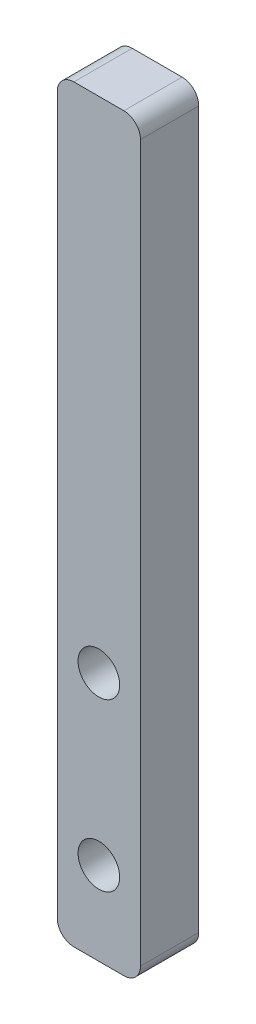
ISO-10303-21;
HEADER;
FILE_DESCRIPTION(('STEP AP214'),'2;1');
FILE_NAME('part.step','',(''),(''),'','','');
FILE_SCHEMA(('AUTOMOTIVE_DESIGN { 1 0 10303 214 1 1 1 1 }'));
ENDSEC;
DATA;
#1=APPLICATION_CONTEXT('core data for automotive mechanical design processes');
#2=APPLICATION_PROTOCOL_DEFINITION('international standard','automotive_design',2000,#1);
#3=PRODUCT_CONTEXT('',#1,'mechanical');
#4=PRODUCT('Part','Part','',(#3));
#5=PRODUCT_RELATED_PRODUCT_CATEGORY('part','',(#4));
#6=PRODUCT_DEFINITION_FORMATION('','',#4);
#7=PRODUCT_DEFINITION_CONTEXT('part definition',#1,'design');
#8=PRODUCT_DEFINITION('design','',#6,#7);
#9=PRODUCT_DEFINITION_SHAPE('','',#8);
#10=(LENGTH_UNIT() NAMED_UNIT(*) SI_UNIT(.MILLI.,.METRE.));
#11=(NAMED_UNIT(*) PLANE_ANGLE_UNIT() SI_UNIT($,.RADIAN.));
#12=(NAMED_UNIT(*) SI_UNIT($,.STERADIAN.) SOLID_ANGLE_UNIT());
#13=UNCERTAINTY_MEASURE_WITH_UNIT(LENGTH_MEASURE(1.E-05),#10,'distance_accuracy_value','');
#14=(GEOMETRIC_REPRESENTATION_CONTEXT(3) GLOBAL_UNCERTAINTY_ASSIGNED_CONTEXT((#13)) GLOBAL_UNIT_ASSIGNED_CONTEXT((#10,
#11,#12)) REPRESENTATION_CONTEXT('',''));
#15=CARTESIAN_POINT('',(0.,0.,0.));
#16=DIRECTION('',(0.,0.,1.));
#17=DIRECTION('',(1.,0.,0.));
#18=AXIS2_PLACEMENT_3D('',#15,#16,#17);
#19=CARTESIAN_POINT('',(-5.00000000000001,45.,7.));
#20=DIRECTION('',(1.,0.,0.));
#21=DIRECTION('',(0.,1.,0.));
#22=AXIS2_PLACEMENT_3D('',#19,#20,#21);
#23=PLANE('',#22);
#24=DIRECTION('',(0.,-1.,0.));
#25=VECTOR('',#24,1.);
#26=CARTESIAN_POINT('',(-5.00000000000001,45.,7.));
#27=LINE('',#26,#25);
#28=CARTESIAN_POINT('',(-5.00000000000001,43.,7.));
#29=VERTEX_POINT('',#28);
#30=CARTESIAN_POINT('',(-5.,-42.9999999999999,7.));
#31=VERTEX_POINT('',#30);
#32=EDGE_CURVE('E127',#29,#31,#27,.T.);
#33=ORIENTED_EDGE('',*,*,#32,.F.);
#34=DIRECTION('',(0.,0.,-1.));
#35=VECTOR('',#34,1.);
#36=CARTESIAN_POINT('',(-5.00000000000001,43.,7.));
#37=LINE('',#36,#35);
#38=CARTESIAN_POINT('',(-5.00000000000001,43.,0.));
#39=VERTEX_POINT('',#38);
#40=EDGE_CURVE('E111',#29,#39,#37,.T.);
#41=ORIENTED_EDGE('',*,*,#40,.T.);
#42=DIRECTION('',(0.,-1.,0.));
#43=VECTOR('',#42,1.);
#44=CARTESIAN_POINT('',(-5.00000000000001,45.,0.));
#45=LINE('',#44,#43);
#46=CARTESIAN_POINT('',(-5.,-42.9999999999999,0.));
#47=VERTEX_POINT('',#46);
#48=EDGE_CURVE('E124',#39,#47,#45,.T.);
#49=ORIENTED_EDGE('',*,*,#48,.T.);
#50=DIRECTION('',(0.,0.,-1.));
#51=VECTOR('',#50,1.);
#52=CARTESIAN_POINT('',(-5.,-43.,7.));
#53=LINE('',#52,#51);
#54=EDGE_CURVE('E130',#47,#31,#53,.F.);
#55=ORIENTED_EDGE('',*,*,#54,.T.);
#56=EDGE_LOOP('',(#33,#41,#49,#55));
#57=FACE_BOUND('',#56,.T.);
#58=ADVANCED_FACE('F39',(#57),#23,.F.);
#59=CARTESIAN_POINT('',(5.,-45.,7.));
#60=DIRECTION('',(0.,1.,0.));
#61=DIRECTION('',(0.,0.,1.));
#62=AXIS2_PLACEMENT_3D('',#59,#60,#61);
#63=PLANE('',#62);
#64=DIRECTION('',(1.,0.,0.));
#65=VECTOR('',#64,1.);
#66=CARTESIAN_POINT('',(5.,-45.,7.));
#67=LINE('',#66,#65);
#68=CARTESIAN_POINT('',(-3.,-45.,7.));
#69=VERTEX_POINT('',#68);
#70=CARTESIAN_POINT('',(3.,-45.,7.));
#71=VERTEX_POINT('',#70);
#72=EDGE_CURVE('E190',#69,#71,#67,.T.);
#73=ORIENTED_EDGE('',*,*,#72,.F.);
#74=DIRECTION('',(0.,0.,-1.));
#75=VECTOR('',#74,1.);
#76=CARTESIAN_POINT('',(-3.,-45.,7.));
#77=LINE('',#76,#75);
#78=CARTESIAN_POINT('',(-3.,-45.,0.));
#79=VERTEX_POINT('',#78);
#80=EDGE_CURVE('E11',#69,#79,#77,.T.);
#81=ORIENTED_EDGE('',*,*,#80,.T.);
#82=DIRECTION('',(1.,0.,0.));
#83=VECTOR('',#82,1.);
#84=CARTESIAN_POINT('',(5.,-45.,0.));
#85=LINE('',#84,#83);
#86=CARTESIAN_POINT('',(3.,-45.,0.));
#87=VERTEX_POINT('',#86);
#88=EDGE_CURVE('E136',#79,#87,#85,.T.);
#89=ORIENTED_EDGE('',*,*,#88,.T.);
#90=DIRECTION('',(0.,0.,-1.));
#91=VECTOR('',#90,1.);
#92=CARTESIAN_POINT('',(3.,-45.,7.));
#93=LINE('',#92,#91);
#94=EDGE_CURVE('E48',#87,#71,#93,.F.);
#95=ORIENTED_EDGE('',*,*,#94,.T.);
#96=EDGE_LOOP('',(#73,#81,#89,#95));
#97=FACE_BOUND('',#96,.T.);
#98=ADVANCED_FACE('F189',(#97),#63,.F.);
#99=CARTESIAN_POINT('',(4.99999999999999,45.,7.));
#100=DIRECTION('',(-1.,0.,0.));
#101=DIRECTION('',(0.,-1.,0.));
#102=AXIS2_PLACEMENT_3D('',#99,#100,#101);
#103=PLANE('',#102);
#104=DIRECTION('',(0.,1.,0.));
#105=VECTOR('',#104,1.);
#106=CARTESIAN_POINT('',(4.99999999999999,45.,0.));
#107=LINE('',#106,#105);
#108=CARTESIAN_POINT('',(5.,-42.9999999999999,0.));
#109=VERTEX_POINT('',#108);
#110=CARTESIAN_POINT('',(4.99999999999999,43.,0.));
#111=VERTEX_POINT('',#110);
#112=EDGE_CURVE('E142',#109,#111,#107,.T.);
#113=ORIENTED_EDGE('',*,*,#112,.T.);
#114=DIRECTION('',(0.,0.,-1.));
#115=VECTOR('',#114,1.);
#116=CARTESIAN_POINT('',(4.99999999999999,43.,7.));
#117=LINE('',#116,#115);
#118=CARTESIAN_POINT('',(4.99999999999999,43.,7.));
#119=VERTEX_POINT('',#118);
#120=EDGE_CURVE('E55',#111,#119,#117,.F.);
#121=ORIENTED_EDGE('',*,*,#120,.T.);
#122=DIRECTION('',(0.,1.,0.));
#123=VECTOR('',#122,1.);
#124=CARTESIAN_POINT('',(4.99999999999999,45.,7.));
#125=LINE('',#124,#123);
#126=CARTESIAN_POINT('',(5.,-42.9999999999999,7.));
#127=VERTEX_POINT('',#126);
#128=EDGE_CURVE('E197',#127,#119,#125,.T.);
#129=ORIENTED_EDGE('',*,*,#128,.F.);
#130=DIRECTION('',(0.,0.,-1.));
#131=VECTOR('',#130,1.);
#132=CARTESIAN_POINT('',(5.,-43.,7.));
#133=LINE('',#132,#131);
#134=EDGE_CURVE('E180',#127,#109,#133,.T.);
#135=ORIENTED_EDGE('',*,*,#134,.T.);
#136=EDGE_LOOP('',(#113,#121,#129,#135));
#137=FACE_BOUND('',#136,.T.);
#138=ADVANCED_FACE('F201',(#137),#103,.F.);
#139=CARTESIAN_POINT('',(4.99999999999999,45.,7.));
#140=DIRECTION('',(0.,-1.,0.));
#141=DIRECTION('',(0.,0.,-1.));
#142=AXIS2_PLACEMENT_3D('',#139,#140,#141);
#143=PLANE('',#142);
#144=DIRECTION('',(-1.,0.,0.));
#145=VECTOR('',#144,1.);
#146=CARTESIAN_POINT('',(4.99999999999999,45.,0.));
#147=LINE('',#146,#145);
#148=CARTESIAN_POINT('',(2.99999999999999,45.,0.));
#149=VERTEX_POINT('',#148);
#150=CARTESIAN_POINT('',(-3.00000000000001,45.,0.));
#151=VERTEX_POINT('',#150);
#152=EDGE_CURVE('E153',#149,#151,#147,.T.);
#153=ORIENTED_EDGE('',*,*,#152,.T.);
#154=DIRECTION('',(0.,0.,-1.));
#155=VECTOR('',#154,1.);
#156=CARTESIAN_POINT('',(-3.00000000000001,45.,7.));
#157=LINE('',#156,#155);
#158=CARTESIAN_POINT('',(-3.00000000000001,45.,7.));
#159=VERTEX_POINT('',#158);
#160=EDGE_CURVE('E112',#151,#159,#157,.F.);
#161=ORIENTED_EDGE('',*,*,#160,.T.);
#162=DIRECTION('',(-1.,0.,0.));
#163=VECTOR('',#162,1.);
#164=CARTESIAN_POINT('',(4.99999999999999,45.,7.));
#165=LINE('',#164,#163);
#166=CARTESIAN_POINT('',(2.99999999999999,45.,7.));
#167=VERTEX_POINT('',#166);
#168=EDGE_CURVE('E148',#167,#159,#165,.T.);
#169=ORIENTED_EDGE('',*,*,#168,.F.);
#170=DIRECTION('',(0.,0.,-1.));
#171=VECTOR('',#170,1.);
#172=CARTESIAN_POINT('',(2.99999999999999,45.,7.));
#173=LINE('',#172,#171);
#174=EDGE_CURVE('E118',#167,#149,#173,.T.);
#175=ORIENTED_EDGE('',*,*,#174,.T.);
#176=EDGE_LOOP('',(#153,#161,#169,#175));
#177=FACE_BOUND('',#176,.T.);
#178=ADVANCED_FACE('F208',(#177),#143,.F.);
#179=CARTESIAN_POINT('',(0.,0.,7.));
#180=DIRECTION('',(0.,0.,-1.));
#181=DIRECTION('',(-1.,0.,0.));
#182=AXIS2_PLACEMENT_3D('',#179,#180,#181);
#183=PLANE('',#182);
#184=CARTESIAN_POINT('',(0.,-35.,7.));
#185=DIRECTION('',(0.,0.,1.));
#186=DIRECTION('',(1.,0.,0.));
#187=AXIS2_PLACEMENT_3D('',#184,#185,#186);
#188=CIRCLE('',#187,2.5);
#189=CARTESIAN_POINT('',(2.5,-35.,7.));
#190=VERTEX_POINT('',#189);
#191=EDGE_CURVE('E145',#190,#190,#188,.T.);
#192=ORIENTED_EDGE('',*,*,#191,.F.);
#193=EDGE_LOOP('',(#192));
#194=FACE_BOUND('',#193,.T.);
#195=CARTESIAN_POINT('',(0.,-15.,7.));
#196=DIRECTION('',(0.,0.,1.));
#197=DIRECTION('',(1.,0.,0.));
#198=AXIS2_PLACEMENT_3D('',#195,#196,#197);
#199=CIRCLE('',#198,2.5);
#200=CARTESIAN_POINT('',(2.5,-15.,7.));
#201=VERTEX_POINT('',#200);
#202=EDGE_CURVE('E214',#201,#201,#199,.T.);
#203=ORIENTED_EDGE('',*,*,#202,.F.);
#204=EDGE_LOOP('',(#203));
#205=FACE_BOUND('',#204,.T.);
#206=ORIENTED_EDGE('',*,*,#168,.T.);
#207=CARTESIAN_POINT('',(-3.00000000000001,43.,7.));
#208=DIRECTION('',(0.,0.,-1.));
#209=DIRECTION('',(-1.,0.,0.));
#210=AXIS2_PLACEMENT_3D('',#207,#208,#209);
#211=CIRCLE('',#210,2.);
#212=EDGE_CURVE('E177',#159,#29,#211,.F.);
#213=ORIENTED_EDGE('',*,*,#212,.T.);
#214=ORIENTED_EDGE('',*,*,#32,.T.);
#215=CARTESIAN_POINT('',(-3.,-43.,7.));
#216=DIRECTION('',(0.,0.,-1.));
#217=DIRECTION('',(-1.,0.,0.));
#218=AXIS2_PLACEMENT_3D('',#215,#216,#217);
#219=CIRCLE('',#218,2.);
#220=EDGE_CURVE('E171',#31,#69,#219,.F.);
#221=ORIENTED_EDGE('',*,*,#220,.T.);
#222=ORIENTED_EDGE('',*,*,#72,.T.);
#223=CARTESIAN_POINT('',(3.,-43.,7.));
#224=DIRECTION('',(0.,0.,-1.));
#225=DIRECTION('',(-1.,0.,0.));
#226=AXIS2_PLACEMENT_3D('',#223,#224,#225);
#227=CIRCLE('',#226,2.);
#228=EDGE_CURVE('E62',#71,#127,#227,.F.);
#229=ORIENTED_EDGE('',*,*,#228,.T.);
#230=ORIENTED_EDGE('',*,*,#128,.T.);
#231=CARTESIAN_POINT('',(2.99999999999999,43.,7.));
#232=DIRECTION('',(0.,0.,-1.));
#233=DIRECTION('',(-1.,0.,0.));
#234=AXIS2_PLACEMENT_3D('',#231,#232,#233);
#235=CIRCLE('',#234,2.);
#236=EDGE_CURVE('E174',#119,#167,#235,.F.);
#237=ORIENTED_EDGE('',*,*,#236,.T.);
#238=EDGE_LOOP('',(#206,#213,#214,#221,#222,#229,#230,#237));
#239=FACE_BOUND('',#238,.T.);
#240=ADVANCED_FACE('F194',(#194,#205,#239),#183,.F.);
#241=CARTESIAN_POINT('',(0.,0.,0.));
#242=DIRECTION('',(0.,0.,-1.));
#243=DIRECTION('',(-1.,0.,0.));
#244=AXIS2_PLACEMENT_3D('',#241,#242,#243);
#245=PLANE('',#244);
#246=CARTESIAN_POINT('',(0.,-35.,0.));
#247=DIRECTION('',(0.,0.,1.));
#248=DIRECTION('',(1.,0.,0.));
#249=AXIS2_PLACEMENT_3D('',#246,#247,#248);
#250=CIRCLE('',#249,2.5);
#251=CARTESIAN_POINT('',(2.5,-35.,0.));
#252=VERTEX_POINT('',#251);
#253=EDGE_CURVE('E137',#252,#252,#250,.T.);
#254=ORIENTED_EDGE('',*,*,#253,.T.);
#255=EDGE_LOOP('',(#254));
#256=FACE_BOUND('',#255,.T.);
#257=CARTESIAN_POINT('',(0.,-15.,0.));
#258=DIRECTION('',(0.,0.,1.));
#259=DIRECTION('',(1.,0.,0.));
#260=AXIS2_PLACEMENT_3D('',#257,#258,#259);
#261=CIRCLE('',#260,2.5);
#262=CARTESIAN_POINT('',(2.5,-15.,0.));
#263=VERTEX_POINT('',#262);
#264=EDGE_CURVE('E218',#263,#263,#261,.T.);
#265=ORIENTED_EDGE('',*,*,#264,.T.);
#266=EDGE_LOOP('',(#265));
#267=FACE_BOUND('',#266,.T.);
#268=ORIENTED_EDGE('',*,*,#48,.F.);
#269=CARTESIAN_POINT('',(-3.00000000000001,43.,0.));
#270=DIRECTION('',(0.,0.,-1.));
#271=DIRECTION('',(-1.,0.,0.));
#272=AXIS2_PLACEMENT_3D('',#269,#270,#271);
#273=CIRCLE('',#272,2.);
#274=EDGE_CURVE('E107',#39,#151,#273,.T.);
#275=ORIENTED_EDGE('',*,*,#274,.T.);
#276=ORIENTED_EDGE('',*,*,#152,.F.);
#277=CARTESIAN_POINT('',(2.99999999999999,43.,0.));
#278=DIRECTION('',(0.,0.,-1.));
#279=DIRECTION('',(-1.,0.,0.));
#280=AXIS2_PLACEMENT_3D('',#277,#278,#279);
#281=CIRCLE('',#280,2.);
#282=EDGE_CURVE('E119',#149,#111,#281,.T.);
#283=ORIENTED_EDGE('',*,*,#282,.T.);
#284=ORIENTED_EDGE('',*,*,#112,.F.);
#285=CARTESIAN_POINT('',(3.,-43.,0.));
#286=DIRECTION('',(0.,0.,-1.));
#287=DIRECTION('',(-1.,0.,0.));
#288=AXIS2_PLACEMENT_3D('',#285,#286,#287);
#289=CIRCLE('',#288,2.);
#290=EDGE_CURVE('E129',#109,#87,#289,.T.);
#291=ORIENTED_EDGE('',*,*,#290,.T.);
#292=ORIENTED_EDGE('',*,*,#88,.F.);
#293=CARTESIAN_POINT('',(-3.,-43.,0.));
#294=DIRECTION('',(0.,0.,-1.));
#295=DIRECTION('',(-1.,0.,0.));
#296=AXIS2_PLACEMENT_3D('',#293,#294,#295);
#297=CIRCLE('',#296,2.);
#298=EDGE_CURVE('E134',#79,#47,#297,.T.);
#299=ORIENTED_EDGE('',*,*,#298,.T.);
#300=EDGE_LOOP('',(#268,#275,#276,#283,#284,#291,#292,#299));
#301=FACE_BOUND('',#300,.T.);
#302=ADVANCED_FACE('F132',(#256,#267,#301),#245,.T.);
#303=CARTESIAN_POINT('',(0.,-15.,0.));
#304=DIRECTION('',(0.,0.,1.));
#305=DIRECTION('',(1.,0.,0.));
#306=AXIS2_PLACEMENT_3D('',#303,#304,#305);
#307=CYLINDRICAL_SURFACE('',#306,2.5);
#308=ORIENTED_EDGE('',*,*,#264,.F.);
#309=EDGE_LOOP('',(#308));
#310=FACE_BOUND('',#309,.T.);
#311=ORIENTED_EDGE('',*,*,#202,.T.);
#312=EDGE_LOOP('',(#311));
#313=FACE_BOUND('',#312,.T.);
#314=ADVANCED_FACE('F233',(#310,#313),#307,.F.);
#315=CARTESIAN_POINT('',(0.,-35.,0.));
#316=DIRECTION('',(0.,0.,1.));
#317=DIRECTION('',(1.,0.,0.));
#318=AXIS2_PLACEMENT_3D('',#315,#316,#317);
#319=CYLINDRICAL_SURFACE('',#318,2.5);
#320=ORIENTED_EDGE('',*,*,#253,.F.);
#321=EDGE_LOOP('',(#320));
#322=FACE_BOUND('',#321,.T.);
#323=ORIENTED_EDGE('',*,*,#191,.T.);
#324=EDGE_LOOP('',(#323));
#325=FACE_BOUND('',#324,.T.);
#326=ADVANCED_FACE('F226',(#322,#325),#319,.F.);
#327=CARTESIAN_POINT('',(-3.00000000000001,43.,7.));
#328=DIRECTION('',(0.,0.,-1.));
#329=DIRECTION('',(-1.,0.,0.));
#330=AXIS2_PLACEMENT_3D('',#327,#328,#329);
#331=CYLINDRICAL_SURFACE('',#330,2.);
#332=ORIENTED_EDGE('',*,*,#212,.F.);
#333=ORIENTED_EDGE('',*,*,#160,.F.);
#334=ORIENTED_EDGE('',*,*,#274,.F.);
#335=ORIENTED_EDGE('',*,*,#40,.F.);
#336=EDGE_LOOP('',(#332,#333,#334,#335));
#337=FACE_BOUND('',#336,.T.);
#338=ADVANCED_FACE('F110',(#337),#331,.T.);
#339=CARTESIAN_POINT('',(2.99999999999999,43.,7.));
#340=DIRECTION('',(0.,0.,-1.));
#341=DIRECTION('',(-1.,0.,0.));
#342=AXIS2_PLACEMENT_3D('',#339,#340,#341);
#343=CYLINDRICAL_SURFACE('',#342,2.);
#344=ORIENTED_EDGE('',*,*,#236,.F.);
#345=ORIENTED_EDGE('',*,*,#120,.F.);
#346=ORIENTED_EDGE('',*,*,#282,.F.);
#347=ORIENTED_EDGE('',*,*,#174,.F.);
#348=EDGE_LOOP('',(#344,#345,#346,#347));
#349=FACE_BOUND('',#348,.T.);
#350=ADVANCED_FACE('F205',(#349),#343,.T.);
#351=CARTESIAN_POINT('',(-3.,-43.,7.));
#352=DIRECTION('',(0.,0.,-1.));
#353=DIRECTION('',(-1.,0.,0.));
#354=AXIS2_PLACEMENT_3D('',#351,#352,#353);
#355=CYLINDRICAL_SURFACE('',#354,2.);
#356=ORIENTED_EDGE('',*,*,#220,.F.);
#357=ORIENTED_EDGE('',*,*,#54,.F.);
#358=ORIENTED_EDGE('',*,*,#298,.F.);
#359=ORIENTED_EDGE('',*,*,#80,.F.);
#360=EDGE_LOOP('',(#356,#357,#358,#359));
#361=FACE_BOUND('',#360,.T.);
#362=ADVANCED_FACE('F257',(#361),#355,.T.);
#363=CARTESIAN_POINT('',(3.,-43.,7.));
#364=DIRECTION('',(0.,0.,-1.));
#365=DIRECTION('',(-1.,0.,0.));
#366=AXIS2_PLACEMENT_3D('',#363,#364,#365);
#367=CYLINDRICAL_SURFACE('',#366,2.);
#368=ORIENTED_EDGE('',*,*,#228,.F.);
#369=ORIENTED_EDGE('',*,*,#94,.F.);
#370=ORIENTED_EDGE('',*,*,#290,.F.);
#371=ORIENTED_EDGE('',*,*,#134,.F.);
#372=EDGE_LOOP('',(#368,#369,#370,#371));
#373=FACE_BOUND('',#372,.T.);
#374=ADVANCED_FACE('F41',(#373),#367,.T.);
#375=CLOSED_SHELL('',(#58,#98,#138,#178,#240,#302,#314,#326,#338,#350,#362,#374));
#376=MANIFOLD_SOLID_BREP('B2',#375);
#377=ADVANCED_BREP_SHAPE_REPRESENTATION('',(#18,#376),#14);
#378=SHAPE_DEFINITION_REPRESENTATION(#9,#377);
ENDSEC;
END-ISO-10303-21;
